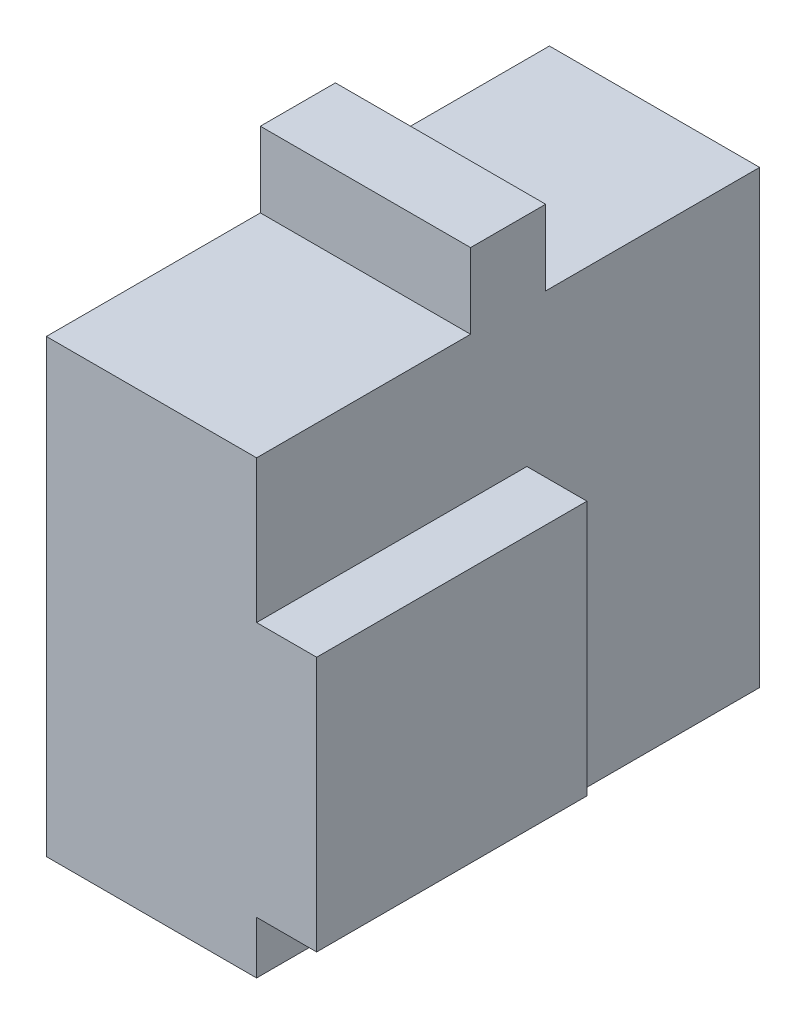
ISO-10303-21;
HEADER;
FILE_DESCRIPTION(('STEP AP214'),'2;1');
FILE_NAME('part.step','',(''),(''),'','','');
FILE_SCHEMA(('AUTOMOTIVE_DESIGN { 1 0 10303 214 1 1 1 1 }'));
ENDSEC;
DATA;
#1=APPLICATION_CONTEXT('core data for automotive mechanical design processes');
#2=APPLICATION_PROTOCOL_DEFINITION('international standard','automotive_design',2000,#1);
#3=PRODUCT_CONTEXT('',#1,'mechanical');
#4=PRODUCT('Part','Part','',(#3));
#5=PRODUCT_RELATED_PRODUCT_CATEGORY('part','',(#4));
#6=PRODUCT_DEFINITION_FORMATION('','',#4);
#7=PRODUCT_DEFINITION_CONTEXT('part definition',#1,'design');
#8=PRODUCT_DEFINITION('design','',#6,#7);
#9=PRODUCT_DEFINITION_SHAPE('','',#8);
#10=(LENGTH_UNIT() NAMED_UNIT(*) SI_UNIT(.MILLI.,.METRE.));
#11=(NAMED_UNIT(*) PLANE_ANGLE_UNIT() SI_UNIT($,.RADIAN.));
#12=(NAMED_UNIT(*) SI_UNIT($,.STERADIAN.) SOLID_ANGLE_UNIT());
#13=UNCERTAINTY_MEASURE_WITH_UNIT(LENGTH_MEASURE(1.E-05),#10,'distance_accuracy_value','');
#14=(GEOMETRIC_REPRESENTATION_CONTEXT(3) GLOBAL_UNCERTAINTY_ASSIGNED_CONTEXT((#13)) GLOBAL_UNIT_ASSIGNED_CONTEXT((#10,
#11,#12)) REPRESENTATION_CONTEXT('',''));
#15=CARTESIAN_POINT('',(0.,0.,0.));
#16=DIRECTION('',(0.,0.,1.));
#17=DIRECTION('',(1.,0.,0.));
#18=AXIS2_PLACEMENT_3D('',#15,#16,#17);
#19=CARTESIAN_POINT('',(28.,30.,33.5));
#20=DIRECTION('',(0.,-1.,0.));
#21=DIRECTION('',(0.,0.,-1.));
#22=AXIS2_PLACEMENT_3D('',#19,#20,#21);
#23=PLANE('',#22);
#24=DIRECTION('',(1.,0.,0.));
#25=VECTOR('',#24,1.);
#26=CARTESIAN_POINT('',(28.,30.,5.));
#27=LINE('',#26,#25);
#28=CARTESIAN_POINT('',(0.,30.,5.));
#29=VERTEX_POINT('',#28);
#30=CARTESIAN_POINT('',(28.,30.,5.));
#31=VERTEX_POINT('',#30);
#32=EDGE_CURVE('E145',#29,#31,#27,.T.);
#33=ORIENTED_EDGE('',*,*,#32,.F.);
#34=DIRECTION('',(0.,0.,1.));
#35=VECTOR('',#34,1.);
#36=CARTESIAN_POINT('',(0.,30.,33.5));
#37=LINE('',#36,#35);
#38=CARTESIAN_POINT('',(0.,30.,33.5));
#39=VERTEX_POINT('',#38);
#40=EDGE_CURVE('E200',#29,#39,#37,.T.);
#41=ORIENTED_EDGE('',*,*,#40,.T.);
#42=DIRECTION('',(-1.,0.,0.));
#43=VECTOR('',#42,1.);
#44=CARTESIAN_POINT('',(28.,30.,33.5));
#45=LINE('',#44,#43);
#46=CARTESIAN_POINT('',(28.,30.,33.5));
#47=VERTEX_POINT('',#46);
#48=EDGE_CURVE('E193',#47,#39,#45,.T.);
#49=ORIENTED_EDGE('',*,*,#48,.F.);
#50=DIRECTION('',(0.,0.,1.));
#51=VECTOR('',#50,1.);
#52=CARTESIAN_POINT('',(28.,30.,33.5));
#53=LINE('',#52,#51);
#54=EDGE_CURVE('E51',#31,#47,#53,.T.);
#55=ORIENTED_EDGE('',*,*,#54,.F.);
#56=EDGE_LOOP('',(#33,#41,#49,#55));
#57=FACE_BOUND('',#56,.T.);
#58=ADVANCED_FACE('F36',(#57),#23,.F.);
#59=DIRECTION('',(-1.,0.,0.));
#60=VECTOR('',#59,1.);
#61=CARTESIAN_POINT('',(28.,30.,-5.));
#62=LINE('',#61,#60);
#63=CARTESIAN_POINT('',(28.,30.,-5.));
#64=VERTEX_POINT('',#63);
#65=CARTESIAN_POINT('',(0.,30.,-5.));
#66=VERTEX_POINT('',#65);
#67=EDGE_CURVE('E59',#64,#66,#62,.T.);
#68=ORIENTED_EDGE('',*,*,#67,.F.);
#69=CARTESIAN_POINT('',(28.,30.,-33.5));
#70=VERTEX_POINT('',#69);
#71=EDGE_CURVE('E148',#70,#64,#53,.T.);
#72=ORIENTED_EDGE('',*,*,#71,.F.);
#73=DIRECTION('',(-1.,0.,0.));
#74=VECTOR('',#73,1.);
#75=CARTESIAN_POINT('',(28.,30.,-33.5));
#76=LINE('',#75,#74);
#77=CARTESIAN_POINT('',(0.,30.,-33.5));
#78=VERTEX_POINT('',#77);
#79=EDGE_CURVE('E205',#70,#78,#76,.T.);
#80=ORIENTED_EDGE('',*,*,#79,.T.);
#81=EDGE_CURVE('E201',#78,#66,#37,.T.);
#82=ORIENTED_EDGE('',*,*,#81,.T.);
#83=EDGE_LOOP('',(#68,#72,#80,#82));
#84=FACE_BOUND('',#83,.T.);
#85=ADVANCED_FACE('F220',(#84),#23,.F.);
#86=CARTESIAN_POINT('',(28.,30.,33.5));
#87=DIRECTION('',(0.,0.,-1.));
#88=DIRECTION('',(-1.,0.,0.));
#89=AXIS2_PLACEMENT_3D('',#86,#87,#88);
#90=PLANE('',#89);
#91=DIRECTION('',(0.,-1.,0.));
#92=VECTOR('',#91,1.);
#93=CARTESIAN_POINT('',(0.,30.,33.5));
#94=LINE('',#93,#92);
#95=CARTESIAN_POINT('',(0.,-30.,33.5));
#96=VERTEX_POINT('',#95);
#97=EDGE_CURVE('E184',#39,#96,#94,.T.);
#98=ORIENTED_EDGE('',*,*,#97,.T.);
#99=DIRECTION('',(-1.,0.,0.));
#100=VECTOR('',#99,1.);
#101=CARTESIAN_POINT('',(28.,-30.,33.5));
#102=LINE('',#101,#100);
#103=CARTESIAN_POINT('',(28.,-30.,33.5));
#104=VERTEX_POINT('',#103);
#105=EDGE_CURVE('E11',#104,#96,#102,.T.);
#106=ORIENTED_EDGE('',*,*,#105,.F.);
#107=DIRECTION('',(0.,-1.,0.));
#108=VECTOR('',#107,1.);
#109=CARTESIAN_POINT('',(28.,30.,33.5));
#110=LINE('',#109,#108);
#111=CARTESIAN_POINT('',(28.,-23.,33.5));
#112=VERTEX_POINT('',#111);
#113=EDGE_CURVE('E188',#112,#104,#110,.T.);
#114=ORIENTED_EDGE('',*,*,#113,.F.);
#115=DIRECTION('',(-1.,0.,0.));
#116=VECTOR('',#115,1.);
#117=CARTESIAN_POINT('',(36.,-23.,33.5));
#118=LINE('',#117,#116);
#119=CARTESIAN_POINT('',(36.,-23.,33.5));
#120=VERTEX_POINT('',#119);
#121=EDGE_CURVE('E181',#120,#112,#118,.T.);
#122=ORIENTED_EDGE('',*,*,#121,.F.);
#123=DIRECTION('',(0.,-1.,0.));
#124=VECTOR('',#123,1.);
#125=CARTESIAN_POINT('',(36.,-23.,33.5));
#126=LINE('',#125,#124);
#127=CARTESIAN_POINT('',(36.,11.,33.5));
#128=VERTEX_POINT('',#127);
#129=EDGE_CURVE('E158',#128,#120,#126,.T.);
#130=ORIENTED_EDGE('',*,*,#129,.F.);
#131=DIRECTION('',(-1.,0.,0.));
#132=VECTOR('',#131,1.);
#133=CARTESIAN_POINT('',(36.,11.,33.5));
#134=LINE('',#133,#132);
#135=CARTESIAN_POINT('',(28.,11.,33.5));
#136=VERTEX_POINT('',#135);
#137=EDGE_CURVE('E167',#128,#136,#134,.T.);
#138=ORIENTED_EDGE('',*,*,#137,.T.);
#139=EDGE_CURVE('E185',#47,#136,#110,.T.);
#140=ORIENTED_EDGE('',*,*,#139,.F.);
#141=ORIENTED_EDGE('',*,*,#48,.T.);
#142=EDGE_LOOP('',(#98,#106,#114,#122,#130,#138,#140,#141));
#143=FACE_BOUND('',#142,.T.);
#144=ADVANCED_FACE('F38',(#143),#90,.F.);
#145=CARTESIAN_POINT('',(28.,-30.,33.5));
#146=DIRECTION('',(0.,1.,0.));
#147=DIRECTION('',(0.,0.,1.));
#148=AXIS2_PLACEMENT_3D('',#145,#146,#147);
#149=PLANE('',#148);
#150=DIRECTION('',(0.,0.,-1.));
#151=VECTOR('',#150,1.);
#152=CARTESIAN_POINT('',(0.,-30.,33.5));
#153=LINE('',#152,#151);
#154=CARTESIAN_POINT('',(0.,-30.,-33.5));
#155=VERTEX_POINT('',#154);
#156=EDGE_CURVE('E196',#96,#155,#153,.T.);
#157=ORIENTED_EDGE('',*,*,#156,.T.);
#158=DIRECTION('',(-1.,0.,0.));
#159=VECTOR('',#158,1.);
#160=CARTESIAN_POINT('',(28.,-30.,-33.5));
#161=LINE('',#160,#159);
#162=CARTESIAN_POINT('',(28.,-30.,-33.5));
#163=VERTEX_POINT('',#162);
#164=EDGE_CURVE('E44',#163,#155,#161,.T.);
#165=ORIENTED_EDGE('',*,*,#164,.F.);
#166=DIRECTION('',(0.,0.,-1.));
#167=VECTOR('',#166,1.);
#168=CARTESIAN_POINT('',(28.,-30.,33.5));
#169=LINE('',#168,#167);
#170=EDGE_CURVE('E187',#104,#163,#169,.T.);
#171=ORIENTED_EDGE('',*,*,#170,.F.);
#172=ORIENTED_EDGE('',*,*,#105,.T.);
#173=EDGE_LOOP('',(#157,#165,#171,#172));
#174=FACE_BOUND('',#173,.T.);
#175=ADVANCED_FACE('F249',(#174),#149,.F.);
#176=CARTESIAN_POINT('',(28.,30.,-33.5));
#177=DIRECTION('',(0.,0.,1.));
#178=DIRECTION('',(0.,-1.,0.));
#179=AXIS2_PLACEMENT_3D('',#176,#177,#178);
#180=PLANE('',#179);
#181=DIRECTION('',(0.,1.,0.));
#182=VECTOR('',#181,1.);
#183=CARTESIAN_POINT('',(0.,30.,-33.5));
#184=LINE('',#183,#182);
#185=EDGE_CURVE('E198',#155,#78,#184,.T.);
#186=ORIENTED_EDGE('',*,*,#185,.T.);
#187=ORIENTED_EDGE('',*,*,#79,.F.);
#188=DIRECTION('',(0.,1.,0.));
#189=VECTOR('',#188,1.);
#190=CARTESIAN_POINT('',(28.,30.,-33.5));
#191=LINE('',#190,#189);
#192=EDGE_CURVE('E190',#163,#70,#191,.T.);
#193=ORIENTED_EDGE('',*,*,#192,.F.);
#194=ORIENTED_EDGE('',*,*,#164,.T.);
#195=EDGE_LOOP('',(#186,#187,#193,#194));
#196=FACE_BOUND('',#195,.T.);
#197=ADVANCED_FACE('F212',(#196),#180,.F.);
#198=CARTESIAN_POINT('',(28.,0.,0.));
#199=DIRECTION('',(1.,0.,0.));
#200=DIRECTION('',(0.,0.,-1.));
#201=AXIS2_PLACEMENT_3D('',#198,#199,#200);
#202=PLANE('',#201);
#203=DIRECTION('',(0.,0.,1.));
#204=VECTOR('',#203,1.);
#205=CARTESIAN_POINT('',(28.,11.,33.5));
#206=LINE('',#205,#204);
#207=CARTESIAN_POINT('',(28.,11.,-2.5));
#208=VERTEX_POINT('',#207);
#209=EDGE_CURVE('E162',#208,#136,#206,.T.);
#210=ORIENTED_EDGE('',*,*,#209,.F.);
#211=DIRECTION('',(0.,1.,0.));
#212=VECTOR('',#211,1.);
#213=CARTESIAN_POINT('',(28.,-23.,-2.5));
#214=LINE('',#213,#212);
#215=CARTESIAN_POINT('',(28.,-23.,-2.5));
#216=VERTEX_POINT('',#215);
#217=EDGE_CURVE('E152',#216,#208,#214,.T.);
#218=ORIENTED_EDGE('',*,*,#217,.F.);
#219=DIRECTION('',(0.,0.,-1.));
#220=VECTOR('',#219,1.);
#221=CARTESIAN_POINT('',(28.,-23.,33.5));
#222=LINE('',#221,#220);
#223=EDGE_CURVE('E149',#112,#216,#222,.T.);
#224=ORIENTED_EDGE('',*,*,#223,.F.);
#225=ORIENTED_EDGE('',*,*,#113,.T.);
#226=ORIENTED_EDGE('',*,*,#170,.T.);
#227=ORIENTED_EDGE('',*,*,#192,.T.);
#228=ORIENTED_EDGE('',*,*,#71,.T.);
#229=DIRECTION('',(0.,-1.,0.));
#230=VECTOR('',#229,1.);
#231=CARTESIAN_POINT('',(28.,40.,-5.));
#232=LINE('',#231,#230);
#233=CARTESIAN_POINT('',(28.,40.,-5.));
#234=VERTEX_POINT('',#233);
#235=EDGE_CURVE('E130',#234,#64,#232,.T.);
#236=ORIENTED_EDGE('',*,*,#235,.F.);
#237=DIRECTION('',(0.,0.,-1.));
#238=VECTOR('',#237,1.);
#239=CARTESIAN_POINT('',(28.,40.,5.));
#240=LINE('',#239,#238);
#241=CARTESIAN_POINT('',(28.,40.,5.));
#242=VERTEX_POINT('',#241);
#243=EDGE_CURVE('E136',#242,#234,#240,.T.);
#244=ORIENTED_EDGE('',*,*,#243,.F.);
#245=DIRECTION('',(0.,-1.,0.));
#246=VECTOR('',#245,1.);
#247=CARTESIAN_POINT('',(28.,40.,5.));
#248=LINE('',#247,#246);
#249=EDGE_CURVE('E226',#242,#31,#248,.T.);
#250=ORIENTED_EDGE('',*,*,#249,.T.);
#251=ORIENTED_EDGE('',*,*,#54,.T.);
#252=ORIENTED_EDGE('',*,*,#139,.T.);
#253=EDGE_LOOP('',(#210,#218,#224,#225,#226,#227,#228,#236,#244,#250,#251,#252));
#254=FACE_BOUND('',#253,.T.);
#255=ADVANCED_FACE('F147',(#254),#202,.T.);
#256=CARTESIAN_POINT('',(0.,0.,0.));
#257=DIRECTION('',(1.,0.,0.));
#258=DIRECTION('',(0.,0.,-1.));
#259=AXIS2_PLACEMENT_3D('',#256,#257,#258);
#260=PLANE('',#259);
#261=ORIENTED_EDGE('',*,*,#97,.F.);
#262=ORIENTED_EDGE('',*,*,#40,.F.);
#263=DIRECTION('',(0.,-1.,0.));
#264=VECTOR('',#263,1.);
#265=CARTESIAN_POINT('',(0.,40.,5.));
#266=LINE('',#265,#264);
#267=CARTESIAN_POINT('',(0.,40.,5.));
#268=VERTEX_POINT('',#267);
#269=EDGE_CURVE('E154',#268,#29,#266,.T.);
#270=ORIENTED_EDGE('',*,*,#269,.F.);
#271=DIRECTION('',(0.,0.,1.));
#272=VECTOR('',#271,1.);
#273=CARTESIAN_POINT('',(0.,40.,5.));
#274=LINE('',#273,#272);
#275=CARTESIAN_POINT('',(0.,40.,-5.));
#276=VERTEX_POINT('',#275);
#277=EDGE_CURVE('E135',#276,#268,#274,.T.);
#278=ORIENTED_EDGE('',*,*,#277,.F.);
#279=DIRECTION('',(0.,-1.,0.));
#280=VECTOR('',#279,1.);
#281=CARTESIAN_POINT('',(0.,40.,-5.));
#282=LINE('',#281,#280);
#283=EDGE_CURVE('E132',#276,#66,#282,.T.);
#284=ORIENTED_EDGE('',*,*,#283,.T.);
#285=ORIENTED_EDGE('',*,*,#81,.F.);
#286=ORIENTED_EDGE('',*,*,#185,.F.);
#287=ORIENTED_EDGE('',*,*,#156,.F.);
#288=EDGE_LOOP('',(#261,#262,#270,#278,#284,#285,#286,#287));
#289=FACE_BOUND('',#288,.T.);
#290=ADVANCED_FACE('F219',(#289),#260,.F.);
#291=CARTESIAN_POINT('',(36.,-23.,33.5));
#292=DIRECTION('',(0.,1.,0.));
#293=DIRECTION('',(0.,0.,1.));
#294=AXIS2_PLACEMENT_3D('',#291,#292,#293);
#295=PLANE('',#294);
#296=ORIENTED_EDGE('',*,*,#223,.T.);
#297=DIRECTION('',(-1.,0.,0.));
#298=VECTOR('',#297,1.);
#299=CARTESIAN_POINT('',(36.,-23.,-2.5));
#300=LINE('',#299,#298);
#301=CARTESIAN_POINT('',(36.,-23.,-2.5));
#302=VERTEX_POINT('',#301);
#303=EDGE_CURVE('E178',#302,#216,#300,.T.);
#304=ORIENTED_EDGE('',*,*,#303,.F.);
#305=DIRECTION('',(0.,0.,-1.));
#306=VECTOR('',#305,1.);
#307=CARTESIAN_POINT('',(36.,-23.,33.5));
#308=LINE('',#307,#306);
#309=EDGE_CURVE('E161',#120,#302,#308,.T.);
#310=ORIENTED_EDGE('',*,*,#309,.F.);
#311=ORIENTED_EDGE('',*,*,#121,.T.);
#312=EDGE_LOOP('',(#296,#304,#310,#311));
#313=FACE_BOUND('',#312,.T.);
#314=ADVANCED_FACE('F247',(#313),#295,.F.);
#315=CARTESIAN_POINT('',(36.,-23.,-2.5));
#316=DIRECTION('',(0.,0.,1.));
#317=DIRECTION('',(1.,0.,0.));
#318=AXIS2_PLACEMENT_3D('',#315,#316,#317);
#319=PLANE('',#318);
#320=ORIENTED_EDGE('',*,*,#217,.T.);
#321=DIRECTION('',(-1.,0.,0.));
#322=VECTOR('',#321,1.);
#323=CARTESIAN_POINT('',(36.,11.,-2.5));
#324=LINE('',#323,#322);
#325=CARTESIAN_POINT('',(36.,11.,-2.5));
#326=VERTEX_POINT('',#325);
#327=EDGE_CURVE('E175',#326,#208,#324,.T.);
#328=ORIENTED_EDGE('',*,*,#327,.F.);
#329=DIRECTION('',(0.,1.,0.));
#330=VECTOR('',#329,1.);
#331=CARTESIAN_POINT('',(36.,-23.,-2.5));
#332=LINE('',#331,#330);
#333=EDGE_CURVE('E164',#302,#326,#332,.T.);
#334=ORIENTED_EDGE('',*,*,#333,.F.);
#335=ORIENTED_EDGE('',*,*,#303,.T.);
#336=EDGE_LOOP('',(#320,#328,#334,#335));
#337=FACE_BOUND('',#336,.T.);
#338=ADVANCED_FACE('F243',(#337),#319,.F.);
#339=CARTESIAN_POINT('',(36.,11.,33.5));
#340=DIRECTION('',(0.,-1.,0.));
#341=DIRECTION('',(0.,0.,-1.));
#342=AXIS2_PLACEMENT_3D('',#339,#340,#341);
#343=PLANE('',#342);
#344=ORIENTED_EDGE('',*,*,#209,.T.);
#345=ORIENTED_EDGE('',*,*,#137,.F.);
#346=DIRECTION('',(0.,0.,1.));
#347=VECTOR('',#346,1.);
#348=CARTESIAN_POINT('',(36.,11.,33.5));
#349=LINE('',#348,#347);
#350=EDGE_CURVE('E166',#326,#128,#349,.T.);
#351=ORIENTED_EDGE('',*,*,#350,.F.);
#352=ORIENTED_EDGE('',*,*,#327,.T.);
#353=EDGE_LOOP('',(#344,#345,#351,#352));
#354=FACE_BOUND('',#353,.T.);
#355=ADVANCED_FACE('F238',(#354),#343,.F.);
#356=CARTESIAN_POINT('',(36.,0.,0.));
#357=DIRECTION('',(-1.,0.,0.));
#358=DIRECTION('',(0.,0.,1.));
#359=AXIS2_PLACEMENT_3D('',#356,#357,#358);
#360=PLANE('',#359);
#361=ORIENTED_EDGE('',*,*,#129,.T.);
#362=ORIENTED_EDGE('',*,*,#309,.T.);
#363=ORIENTED_EDGE('',*,*,#333,.T.);
#364=ORIENTED_EDGE('',*,*,#350,.T.);
#365=EDGE_LOOP('',(#361,#362,#363,#364));
#366=FACE_BOUND('',#365,.T.);
#367=ADVANCED_FACE('F272',(#366),#360,.F.);
#368=CARTESIAN_POINT('',(28.,40.,-5.));
#369=DIRECTION('',(0.,0.,1.));
#370=DIRECTION('',(1.,0.,0.));
#371=AXIS2_PLACEMENT_3D('',#368,#369,#370);
#372=PLANE('',#371);
#373=ORIENTED_EDGE('',*,*,#67,.T.);
#374=ORIENTED_EDGE('',*,*,#283,.F.);
#375=DIRECTION('',(-1.,0.,0.));
#376=VECTOR('',#375,1.);
#377=CARTESIAN_POINT('',(28.,40.,-5.));
#378=LINE('',#377,#376);
#379=EDGE_CURVE('E126',#234,#276,#378,.T.);
#380=ORIENTED_EDGE('',*,*,#379,.F.);
#381=ORIENTED_EDGE('',*,*,#235,.T.);
#382=EDGE_LOOP('',(#373,#374,#380,#381));
#383=FACE_BOUND('',#382,.T.);
#384=ADVANCED_FACE('F128',(#383),#372,.F.);
#385=CARTESIAN_POINT('',(28.,40.,5.));
#386=DIRECTION('',(0.,0.,-1.));
#387=DIRECTION('',(-1.,0.,0.));
#388=AXIS2_PLACEMENT_3D('',#385,#386,#387);
#389=PLANE('',#388);
#390=ORIENTED_EDGE('',*,*,#32,.T.);
#391=ORIENTED_EDGE('',*,*,#249,.F.);
#392=DIRECTION('',(1.,0.,0.));
#393=VECTOR('',#392,1.);
#394=CARTESIAN_POINT('',(28.,40.,5.));
#395=LINE('',#394,#393);
#396=EDGE_CURVE('E141',#268,#242,#395,.T.);
#397=ORIENTED_EDGE('',*,*,#396,.F.);
#398=ORIENTED_EDGE('',*,*,#269,.T.);
#399=EDGE_LOOP('',(#390,#391,#397,#398));
#400=FACE_BOUND('',#399,.T.);
#401=ADVANCED_FACE('F230',(#400),#389,.F.);
#402=CARTESIAN_POINT('',(0.,40.,0.));
#403=DIRECTION('',(0.,1.,0.));
#404=DIRECTION('',(0.,0.,1.));
#405=AXIS2_PLACEMENT_3D('',#402,#403,#404);
#406=PLANE('',#405);
#407=ORIENTED_EDGE('',*,*,#243,.T.);
#408=ORIENTED_EDGE('',*,*,#379,.T.);
#409=ORIENTED_EDGE('',*,*,#277,.T.);
#410=ORIENTED_EDGE('',*,*,#396,.T.);
#411=EDGE_LOOP('',(#407,#408,#409,#410));
#412=FACE_BOUND('',#411,.T.);
#413=ADVANCED_FACE('F139',(#412),#406,.T.);
#414=CLOSED_SHELL('',(#58,#85,#144,#175,#197,#255,#290,#314,#338,#355,#367,#384,#401,#413));
#415=MANIFOLD_SOLID_BREP('B2',#414);
#416=ADVANCED_BREP_SHAPE_REPRESENTATION('',(#18,#415),#14);
#417=SHAPE_DEFINITION_REPRESENTATION(#9,#416);
ENDSEC;
END-ISO-10303-21;
